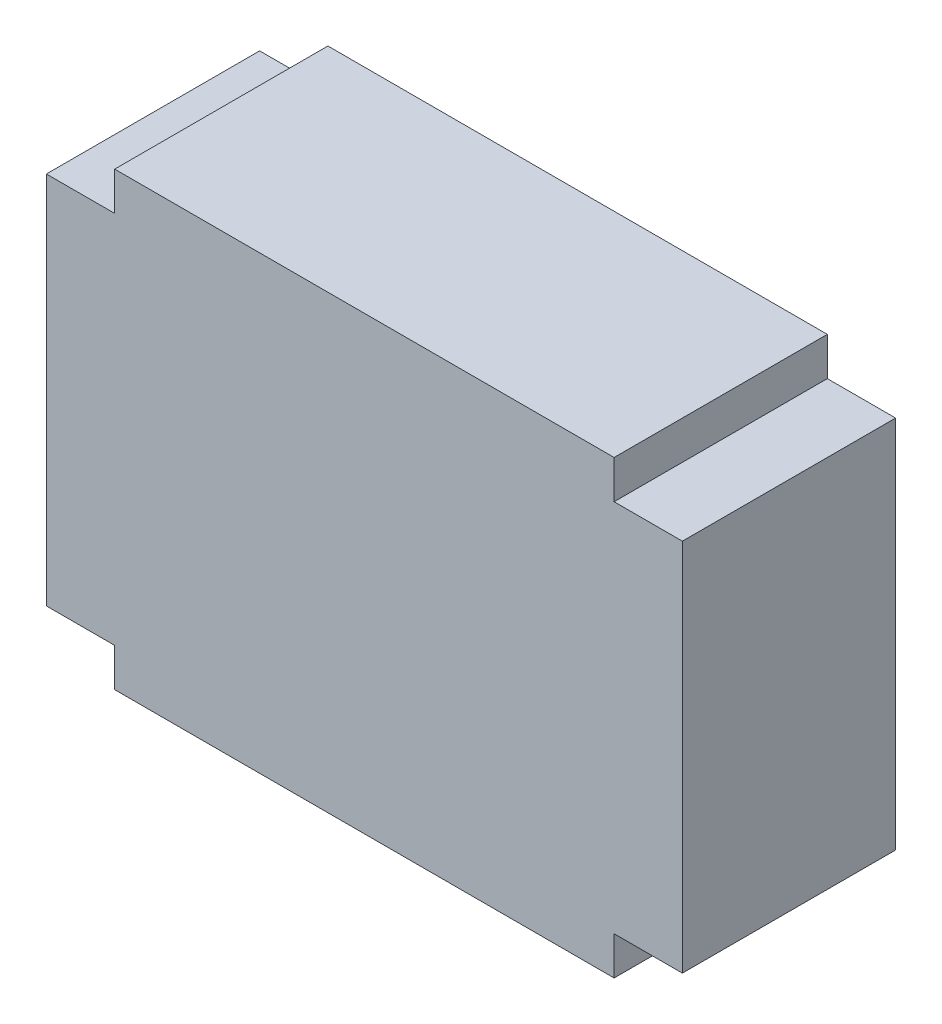
ISO-10303-21;
HEADER;
FILE_DESCRIPTION(('STEP AP214'),'2;1');
FILE_NAME('part.step','',(''),(''),'','','');
FILE_SCHEMA(('AUTOMOTIVE_DESIGN { 1 0 10303 214 1 1 1 1 }'));
ENDSEC;
DATA;
#1=APPLICATION_CONTEXT('core data for automotive mechanical design processes');
#2=APPLICATION_PROTOCOL_DEFINITION('international standard','automotive_design',2000,#1);
#3=PRODUCT_CONTEXT('',#1,'mechanical');
#4=PRODUCT('Part','Part','',(#3));
#5=PRODUCT_RELATED_PRODUCT_CATEGORY('part','',(#4));
#6=PRODUCT_DEFINITION_FORMATION('','',#4);
#7=PRODUCT_DEFINITION_CONTEXT('part definition',#1,'design');
#8=PRODUCT_DEFINITION('design','',#6,#7);
#9=PRODUCT_DEFINITION_SHAPE('','',#8);
#10=(LENGTH_UNIT() NAMED_UNIT(*) SI_UNIT(.MILLI.,.METRE.));
#11=(NAMED_UNIT(*) PLANE_ANGLE_UNIT() SI_UNIT($,.RADIAN.));
#12=(NAMED_UNIT(*) SI_UNIT($,.STERADIAN.) SOLID_ANGLE_UNIT());
#13=UNCERTAINTY_MEASURE_WITH_UNIT(LENGTH_MEASURE(1.E-05),#10,'distance_accuracy_value','');
#14=(GEOMETRIC_REPRESENTATION_CONTEXT(3) GLOBAL_UNCERTAINTY_ASSIGNED_CONTEXT((#13)) GLOBAL_UNIT_ASSIGNED_CONTEXT((#10,
#11,#12)) REPRESENTATION_CONTEXT('',''));
#15=CARTESIAN_POINT('',(0.,0.,0.));
#16=DIRECTION('',(0.,0.,1.));
#17=DIRECTION('',(1.,0.,0.));
#18=AXIS2_PLACEMENT_3D('',#15,#16,#17);
#19=CARTESIAN_POINT('',(-1.7,-1.,1.14));
#20=DIRECTION('',(1.,0.,0.));
#21=DIRECTION('',(0.,0.,-1.));
#22=AXIS2_PLACEMENT_3D('',#19,#20,#21);
#23=PLANE('',#22);
#24=DIRECTION('',(0.,-1.,0.));
#25=VECTOR('',#24,1.);
#26=CARTESIAN_POINT('',(-1.7,-1.,0.));
#27=LINE('',#26,#25);
#28=CARTESIAN_POINT('',(-1.7,1.,0.));
#29=VERTEX_POINT('',#28);
#30=CARTESIAN_POINT('',(-1.7,-1.,0.));
#31=VERTEX_POINT('',#30);
#32=EDGE_CURVE('E154',#29,#31,#27,.T.);
#33=ORIENTED_EDGE('',*,*,#32,.T.);
#34=DIRECTION('',(0.,0.,-1.));
#35=VECTOR('',#34,1.);
#36=CARTESIAN_POINT('',(-1.7,-1.,1.14));
#37=LINE('',#36,#35);
#38=CARTESIAN_POINT('',(-1.7,-1.,1.14));
#39=VERTEX_POINT('',#38);
#40=EDGE_CURVE('E11',#39,#31,#37,.T.);
#41=ORIENTED_EDGE('',*,*,#40,.F.);
#42=DIRECTION('',(0.,-1.,0.));
#43=VECTOR('',#42,1.);
#44=CARTESIAN_POINT('',(-1.7,-1.,1.14));
#45=LINE('',#44,#43);
#46=CARTESIAN_POINT('',(-1.7,1.,1.14));
#47=VERTEX_POINT('',#46);
#48=EDGE_CURVE('E176',#47,#39,#45,.T.);
#49=ORIENTED_EDGE('',*,*,#48,.F.);
#50=DIRECTION('',(0.,0.,-1.));
#51=VECTOR('',#50,1.);
#52=CARTESIAN_POINT('',(-1.7,1.,1.14));
#53=LINE('',#52,#51);
#54=EDGE_CURVE('E150',#47,#29,#53,.T.);
#55=ORIENTED_EDGE('',*,*,#54,.T.);
#56=EDGE_LOOP('',(#33,#41,#49,#55));
#57=FACE_BOUND('',#56,.T.);
#58=ADVANCED_FACE('F34',(#57),#23,.F.);
#59=CARTESIAN_POINT('',(-1.335,-1.,1.14));
#60=DIRECTION('',(0.,1.,0.));
#61=DIRECTION('',(0.,0.,1.));
#62=AXIS2_PLACEMENT_3D('',#59,#60,#61);
#63=PLANE('',#62);
#64=DIRECTION('',(1.,0.,0.));
#65=VECTOR('',#64,1.);
#66=CARTESIAN_POINT('',(-1.335,-1.,0.));
#67=LINE('',#66,#65);
#68=CARTESIAN_POINT('',(-1.335,-1.,0.));
#69=VERTEX_POINT('',#68);
#70=EDGE_CURVE('E157',#31,#69,#67,.T.);
#71=ORIENTED_EDGE('',*,*,#70,.T.);
#72=DIRECTION('',(0.,0.,-1.));
#73=VECTOR('',#72,1.);
#74=CARTESIAN_POINT('',(-1.335,-1.,1.14));
#75=LINE('',#74,#73);
#76=CARTESIAN_POINT('',(-1.335,-1.,1.14));
#77=VERTEX_POINT('',#76);
#78=EDGE_CURVE('E42',#77,#69,#75,.T.);
#79=ORIENTED_EDGE('',*,*,#78,.F.);
#80=DIRECTION('',(1.,0.,0.));
#81=VECTOR('',#80,1.);
#82=CARTESIAN_POINT('',(-1.335,-1.,1.14));
#83=LINE('',#82,#81);
#84=EDGE_CURVE('E105',#39,#77,#83,.T.);
#85=ORIENTED_EDGE('',*,*,#84,.F.);
#86=ORIENTED_EDGE('',*,*,#40,.T.);
#87=EDGE_LOOP('',(#71,#79,#85,#86));
#88=FACE_BOUND('',#87,.T.);
#89=ADVANCED_FACE('F254',(#88),#63,.F.);
#90=CARTESIAN_POINT('',(-1.335,-1.205,1.14));
#91=DIRECTION('',(1.,0.,0.));
#92=DIRECTION('',(0.,0.,-1.));
#93=AXIS2_PLACEMENT_3D('',#90,#91,#92);
#94=PLANE('',#93);
#95=DIRECTION('',(0.,-1.,0.));
#96=VECTOR('',#95,1.);
#97=CARTESIAN_POINT('',(-1.335,-1.205,0.));
#98=LINE('',#97,#96);
#99=CARTESIAN_POINT('',(-1.335,-1.205,0.));
#100=VERTEX_POINT('',#99);
#101=EDGE_CURVE('E159',#69,#100,#98,.T.);
#102=ORIENTED_EDGE('',*,*,#101,.T.);
#103=DIRECTION('',(0.,0.,-1.));
#104=VECTOR('',#103,1.);
#105=CARTESIAN_POINT('',(-1.335,-1.205,1.14));
#106=LINE('',#105,#104);
#107=CARTESIAN_POINT('',(-1.335,-1.205,1.14));
#108=VERTEX_POINT('',#107);
#109=EDGE_CURVE('E195',#108,#100,#106,.T.);
#110=ORIENTED_EDGE('',*,*,#109,.F.);
#111=DIRECTION('',(0.,-1.,0.));
#112=VECTOR('',#111,1.);
#113=CARTESIAN_POINT('',(-1.335,-1.205,1.14));
#114=LINE('',#113,#112);
#115=EDGE_CURVE('E203',#77,#108,#114,.T.);
#116=ORIENTED_EDGE('',*,*,#115,.F.);
#117=ORIENTED_EDGE('',*,*,#78,.T.);
#118=EDGE_LOOP('',(#102,#110,#116,#117));
#119=FACE_BOUND('',#118,.T.);
#120=ADVANCED_FACE('F201',(#119),#94,.F.);
#121=CARTESIAN_POINT('',(1.335,-1.205,1.14));
#122=DIRECTION('',(0.,1.,0.));
#123=DIRECTION('',(0.,0.,1.));
#124=AXIS2_PLACEMENT_3D('',#121,#122,#123);
#125=PLANE('',#124);
#126=DIRECTION('',(1.,0.,0.));
#127=VECTOR('',#126,1.);
#128=CARTESIAN_POINT('',(1.335,-1.205,0.));
#129=LINE('',#128,#127);
#130=CARTESIAN_POINT('',(1.335,-1.205,0.));
#131=VERTEX_POINT('',#130);
#132=EDGE_CURVE('E161',#100,#131,#129,.T.);
#133=ORIENTED_EDGE('',*,*,#132,.T.);
#134=DIRECTION('',(0.,0.,-1.));
#135=VECTOR('',#134,1.);
#136=CARTESIAN_POINT('',(1.335,-1.205,1.14));
#137=LINE('',#136,#135);
#138=CARTESIAN_POINT('',(1.335,-1.205,1.14));
#139=VERTEX_POINT('',#138);
#140=EDGE_CURVE('E192',#139,#131,#137,.T.);
#141=ORIENTED_EDGE('',*,*,#140,.F.);
#142=DIRECTION('',(1.,0.,0.));
#143=VECTOR('',#142,1.);
#144=CARTESIAN_POINT('',(1.335,-1.205,1.14));
#145=LINE('',#144,#143);
#146=EDGE_CURVE('E221',#108,#139,#145,.T.);
#147=ORIENTED_EDGE('',*,*,#146,.F.);
#148=ORIENTED_EDGE('',*,*,#109,.T.);
#149=EDGE_LOOP('',(#133,#141,#147,#148));
#150=FACE_BOUND('',#149,.T.);
#151=ADVANCED_FACE('F212',(#150),#125,.F.);
#152=CARTESIAN_POINT('',(1.335,-1.,1.14));
#153=DIRECTION('',(-1.,0.,0.));
#154=DIRECTION('',(0.,0.,1.));
#155=AXIS2_PLACEMENT_3D('',#152,#153,#154);
#156=PLANE('',#155);
#157=DIRECTION('',(0.,1.,0.));
#158=VECTOR('',#157,1.);
#159=CARTESIAN_POINT('',(1.335,-1.,0.));
#160=LINE('',#159,#158);
#161=CARTESIAN_POINT('',(1.335,-1.,0.));
#162=VERTEX_POINT('',#161);
#163=EDGE_CURVE('E163',#131,#162,#160,.T.);
#164=ORIENTED_EDGE('',*,*,#163,.T.);
#165=DIRECTION('',(0.,0.,-1.));
#166=VECTOR('',#165,1.);
#167=CARTESIAN_POINT('',(1.335,-1.,1.14));
#168=LINE('',#167,#166);
#169=CARTESIAN_POINT('',(1.335,-1.,1.14));
#170=VERTEX_POINT('',#169);
#171=EDGE_CURVE('E189',#170,#162,#168,.T.);
#172=ORIENTED_EDGE('',*,*,#171,.F.);
#173=DIRECTION('',(0.,1.,0.));
#174=VECTOR('',#173,1.);
#175=CARTESIAN_POINT('',(1.335,-1.,1.14));
#176=LINE('',#175,#174);
#177=EDGE_CURVE('E218',#139,#170,#176,.T.);
#178=ORIENTED_EDGE('',*,*,#177,.F.);
#179=ORIENTED_EDGE('',*,*,#140,.T.);
#180=EDGE_LOOP('',(#164,#172,#178,#179));
#181=FACE_BOUND('',#180,.T.);
#182=ADVANCED_FACE('F216',(#181),#156,.F.);
#183=CARTESIAN_POINT('',(1.7,-1.,1.14));
#184=DIRECTION('',(0.,1.,0.));
#185=DIRECTION('',(0.,0.,1.));
#186=AXIS2_PLACEMENT_3D('',#183,#184,#185);
#187=PLANE('',#186);
#188=DIRECTION('',(1.,0.,0.));
#189=VECTOR('',#188,1.);
#190=CARTESIAN_POINT('',(1.7,-1.,0.));
#191=LINE('',#190,#189);
#192=CARTESIAN_POINT('',(1.7,-1.,0.));
#193=VERTEX_POINT('',#192);
#194=EDGE_CURVE('E165',#162,#193,#191,.T.);
#195=ORIENTED_EDGE('',*,*,#194,.T.);
#196=DIRECTION('',(0.,0.,-1.));
#197=VECTOR('',#196,1.);
#198=CARTESIAN_POINT('',(1.7,-1.,1.14));
#199=LINE('',#198,#197);
#200=CARTESIAN_POINT('',(1.7,-1.,1.14));
#201=VERTEX_POINT('',#200);
#202=EDGE_CURVE('E186',#201,#193,#199,.T.);
#203=ORIENTED_EDGE('',*,*,#202,.F.);
#204=DIRECTION('',(1.,0.,0.));
#205=VECTOR('',#204,1.);
#206=CARTESIAN_POINT('',(1.7,-1.,1.14));
#207=LINE('',#206,#205);
#208=EDGE_CURVE('E220',#170,#201,#207,.T.);
#209=ORIENTED_EDGE('',*,*,#208,.F.);
#210=ORIENTED_EDGE('',*,*,#171,.T.);
#211=EDGE_LOOP('',(#195,#203,#209,#210));
#212=FACE_BOUND('',#211,.T.);
#213=ADVANCED_FACE('F267',(#212),#187,.F.);
#214=CARTESIAN_POINT('',(1.7,1.,1.14));
#215=DIRECTION('',(-1.,0.,0.));
#216=DIRECTION('',(0.,0.,1.));
#217=AXIS2_PLACEMENT_3D('',#214,#215,#216);
#218=PLANE('',#217);
#219=DIRECTION('',(0.,1.,0.));
#220=VECTOR('',#219,1.);
#221=CARTESIAN_POINT('',(1.7,1.,0.));
#222=LINE('',#221,#220);
#223=CARTESIAN_POINT('',(1.7,1.,0.));
#224=VERTEX_POINT('',#223);
#225=EDGE_CURVE('E167',#193,#224,#222,.T.);
#226=ORIENTED_EDGE('',*,*,#225,.T.);
#227=DIRECTION('',(0.,0.,-1.));
#228=VECTOR('',#227,1.);
#229=CARTESIAN_POINT('',(1.7,1.,1.14));
#230=LINE('',#229,#228);
#231=CARTESIAN_POINT('',(1.7,1.,1.14));
#232=VERTEX_POINT('',#231);
#233=EDGE_CURVE('E183',#232,#224,#230,.T.);
#234=ORIENTED_EDGE('',*,*,#233,.F.);
#235=DIRECTION('',(0.,1.,0.));
#236=VECTOR('',#235,1.);
#237=CARTESIAN_POINT('',(1.7,1.,1.14));
#238=LINE('',#237,#236);
#239=EDGE_CURVE('E223',#201,#232,#238,.T.);
#240=ORIENTED_EDGE('',*,*,#239,.F.);
#241=ORIENTED_EDGE('',*,*,#202,.T.);
#242=EDGE_LOOP('',(#226,#234,#240,#241));
#243=FACE_BOUND('',#242,.T.);
#244=ADVANCED_FACE('F270',(#243),#218,.F.);
#245=CARTESIAN_POINT('',(1.335,1.,1.14));
#246=DIRECTION('',(0.,-1.,0.));
#247=DIRECTION('',(0.,0.,-1.));
#248=AXIS2_PLACEMENT_3D('',#245,#246,#247);
#249=PLANE('',#248);
#250=DIRECTION('',(-1.,0.,0.));
#251=VECTOR('',#250,1.);
#252=CARTESIAN_POINT('',(1.335,1.,0.));
#253=LINE('',#252,#251);
#254=CARTESIAN_POINT('',(1.335,1.,0.));
#255=VERTEX_POINT('',#254);
#256=EDGE_CURVE('E169',#224,#255,#253,.T.);
#257=ORIENTED_EDGE('',*,*,#256,.T.);
#258=DIRECTION('',(0.,0.,-1.));
#259=VECTOR('',#258,1.);
#260=CARTESIAN_POINT('',(1.335,1.,1.14));
#261=LINE('',#260,#259);
#262=CARTESIAN_POINT('',(1.335,1.,1.14));
#263=VERTEX_POINT('',#262);
#264=EDGE_CURVE('E180',#263,#255,#261,.T.);
#265=ORIENTED_EDGE('',*,*,#264,.F.);
#266=DIRECTION('',(-1.,0.,0.));
#267=VECTOR('',#266,1.);
#268=CARTESIAN_POINT('',(1.335,1.,1.14));
#269=LINE('',#268,#267);
#270=EDGE_CURVE('E229',#232,#263,#269,.T.);
#271=ORIENTED_EDGE('',*,*,#270,.F.);
#272=ORIENTED_EDGE('',*,*,#233,.T.);
#273=EDGE_LOOP('',(#257,#265,#271,#272));
#274=FACE_BOUND('',#273,.T.);
#275=ADVANCED_FACE('F235',(#274),#249,.F.);
#276=CARTESIAN_POINT('',(1.335,1.205,1.14));
#277=DIRECTION('',(-1.,0.,0.));
#278=DIRECTION('',(0.,0.,1.));
#279=AXIS2_PLACEMENT_3D('',#276,#277,#278);
#280=PLANE('',#279);
#281=DIRECTION('',(0.,1.,0.));
#282=VECTOR('',#281,1.);
#283=CARTESIAN_POINT('',(1.335,1.205,0.));
#284=LINE('',#283,#282);
#285=CARTESIAN_POINT('',(1.335,1.205,0.));
#286=VERTEX_POINT('',#285);
#287=EDGE_CURVE('E171',#255,#286,#284,.T.);
#288=ORIENTED_EDGE('',*,*,#287,.T.);
#289=DIRECTION('',(0.,0.,-1.));
#290=VECTOR('',#289,1.);
#291=CARTESIAN_POINT('',(1.335,1.205,1.14));
#292=LINE('',#291,#290);
#293=CARTESIAN_POINT('',(1.335,1.205,1.14));
#294=VERTEX_POINT('',#293);
#295=EDGE_CURVE('E145',#294,#286,#292,.T.);
#296=ORIENTED_EDGE('',*,*,#295,.F.);
#297=DIRECTION('',(0.,1.,0.));
#298=VECTOR('',#297,1.);
#299=CARTESIAN_POINT('',(1.335,1.205,1.14));
#300=LINE('',#299,#298);
#301=EDGE_CURVE('E136',#263,#294,#300,.T.);
#302=ORIENTED_EDGE('',*,*,#301,.F.);
#303=ORIENTED_EDGE('',*,*,#264,.T.);
#304=EDGE_LOOP('',(#288,#296,#302,#303));
#305=FACE_BOUND('',#304,.T.);
#306=ADVANCED_FACE('F239',(#305),#280,.F.);
#307=CARTESIAN_POINT('',(-1.335,1.205,1.14));
#308=DIRECTION('',(0.,-1.,0.));
#309=DIRECTION('',(0.,0.,-1.));
#310=AXIS2_PLACEMENT_3D('',#307,#308,#309);
#311=PLANE('',#310);
#312=DIRECTION('',(-1.,0.,0.));
#313=VECTOR('',#312,1.);
#314=CARTESIAN_POINT('',(-1.335,1.205,0.));
#315=LINE('',#314,#313);
#316=CARTESIAN_POINT('',(-1.335,1.205,0.));
#317=VERTEX_POINT('',#316);
#318=EDGE_CURVE('E144',#286,#317,#315,.T.);
#319=ORIENTED_EDGE('',*,*,#318,.T.);
#320=DIRECTION('',(0.,0.,-1.));
#321=VECTOR('',#320,1.);
#322=CARTESIAN_POINT('',(-1.335,1.205,1.14));
#323=LINE('',#322,#321);
#324=CARTESIAN_POINT('',(-1.335,1.205,1.14));
#325=VERTEX_POINT('',#324);
#326=EDGE_CURVE('E141',#325,#317,#323,.T.);
#327=ORIENTED_EDGE('',*,*,#326,.F.);
#328=DIRECTION('',(-1.,0.,0.));
#329=VECTOR('',#328,1.);
#330=CARTESIAN_POINT('',(-1.335,1.205,1.14));
#331=LINE('',#330,#329);
#332=EDGE_CURVE('E130',#294,#325,#331,.T.);
#333=ORIENTED_EDGE('',*,*,#332,.F.);
#334=ORIENTED_EDGE('',*,*,#295,.T.);
#335=EDGE_LOOP('',(#319,#327,#333,#334));
#336=FACE_BOUND('',#335,.T.);
#337=ADVANCED_FACE('F142',(#336),#311,.F.);
#338=CARTESIAN_POINT('',(-1.335,1.,1.14));
#339=DIRECTION('',(1.,0.,0.));
#340=DIRECTION('',(0.,0.,-1.));
#341=AXIS2_PLACEMENT_3D('',#338,#339,#340);
#342=PLANE('',#341);
#343=DIRECTION('',(0.,-1.,0.));
#344=VECTOR('',#343,1.);
#345=CARTESIAN_POINT('',(-1.335,1.,0.));
#346=LINE('',#345,#344);
#347=CARTESIAN_POINT('',(-1.335,1.,0.));
#348=VERTEX_POINT('',#347);
#349=EDGE_CURVE('E91',#317,#348,#346,.T.);
#350=ORIENTED_EDGE('',*,*,#349,.T.);
#351=DIRECTION('',(0.,0.,-1.));
#352=VECTOR('',#351,1.);
#353=CARTESIAN_POINT('',(-1.335,1.,1.14));
#354=LINE('',#353,#352);
#355=CARTESIAN_POINT('',(-1.335,1.,1.14));
#356=VERTEX_POINT('',#355);
#357=EDGE_CURVE('E146',#356,#348,#354,.T.);
#358=ORIENTED_EDGE('',*,*,#357,.F.);
#359=DIRECTION('',(0.,-1.,0.));
#360=VECTOR('',#359,1.);
#361=CARTESIAN_POINT('',(-1.335,1.,1.14));
#362=LINE('',#361,#360);
#363=EDGE_CURVE('E134',#325,#356,#362,.T.);
#364=ORIENTED_EDGE('',*,*,#363,.F.);
#365=ORIENTED_EDGE('',*,*,#326,.T.);
#366=EDGE_LOOP('',(#350,#358,#364,#365));
#367=FACE_BOUND('',#366,.T.);
#368=ADVANCED_FACE('F148',(#367),#342,.F.);
#369=CARTESIAN_POINT('',(-1.7,1.,1.14));
#370=DIRECTION('',(0.,-1.,0.));
#371=DIRECTION('',(0.,0.,-1.));
#372=AXIS2_PLACEMENT_3D('',#369,#370,#371);
#373=PLANE('',#372);
#374=DIRECTION('',(-1.,0.,0.));
#375=VECTOR('',#374,1.);
#376=CARTESIAN_POINT('',(-1.7,1.,0.));
#377=LINE('',#376,#375);
#378=EDGE_CURVE('E97',#348,#29,#377,.T.);
#379=ORIENTED_EDGE('',*,*,#378,.T.);
#380=ORIENTED_EDGE('',*,*,#54,.F.);
#381=DIRECTION('',(-1.,0.,0.));
#382=VECTOR('',#381,1.);
#383=CARTESIAN_POINT('',(-1.7,1.,1.14));
#384=LINE('',#383,#382);
#385=EDGE_CURVE('E50',#356,#47,#384,.T.);
#386=ORIENTED_EDGE('',*,*,#385,.F.);
#387=ORIENTED_EDGE('',*,*,#357,.T.);
#388=EDGE_LOOP('',(#379,#380,#386,#387));
#389=FACE_BOUND('',#388,.T.);
#390=ADVANCED_FACE('F243',(#389),#373,.F.);
#391=CARTESIAN_POINT('',(0.,0.,1.14));
#392=DIRECTION('',(0.,0.,-1.));
#393=DIRECTION('',(-1.,0.,0.));
#394=AXIS2_PLACEMENT_3D('',#391,#392,#393);
#395=PLANE('',#394);
#396=ORIENTED_EDGE('',*,*,#48,.T.);
#397=ORIENTED_EDGE('',*,*,#84,.T.);
#398=ORIENTED_EDGE('',*,*,#115,.T.);
#399=ORIENTED_EDGE('',*,*,#146,.T.);
#400=ORIENTED_EDGE('',*,*,#177,.T.);
#401=ORIENTED_EDGE('',*,*,#208,.T.);
#402=ORIENTED_EDGE('',*,*,#239,.T.);
#403=ORIENTED_EDGE('',*,*,#270,.T.);
#404=ORIENTED_EDGE('',*,*,#301,.T.);
#405=ORIENTED_EDGE('',*,*,#332,.T.);
#406=ORIENTED_EDGE('',*,*,#363,.T.);
#407=ORIENTED_EDGE('',*,*,#385,.T.);
#408=EDGE_LOOP('',(#396,#397,#398,#399,#400,#401,#402,#403,#404,#405,#406,#407));
#409=FACE_BOUND('',#408,.T.);
#410=ADVANCED_FACE('F132',(#409),#395,.F.);
#411=CARTESIAN_POINT('',(0.,0.,0.));
#412=DIRECTION('',(0.,0.,-1.));
#413=DIRECTION('',(-1.,0.,0.));
#414=AXIS2_PLACEMENT_3D('',#411,#412,#413);
#415=PLANE('',#414);
#416=ORIENTED_EDGE('',*,*,#32,.F.);
#417=ORIENTED_EDGE('',*,*,#378,.F.);
#418=ORIENTED_EDGE('',*,*,#349,.F.);
#419=ORIENTED_EDGE('',*,*,#318,.F.);
#420=ORIENTED_EDGE('',*,*,#287,.F.);
#421=ORIENTED_EDGE('',*,*,#256,.F.);
#422=ORIENTED_EDGE('',*,*,#225,.F.);
#423=ORIENTED_EDGE('',*,*,#194,.F.);
#424=ORIENTED_EDGE('',*,*,#163,.F.);
#425=ORIENTED_EDGE('',*,*,#132,.F.);
#426=ORIENTED_EDGE('',*,*,#101,.F.);
#427=ORIENTED_EDGE('',*,*,#70,.F.);
#428=EDGE_LOOP('',(#416,#417,#418,#419,#420,#421,#422,#423,#424,#425,#426,#427));
#429=FACE_BOUND('',#428,.T.);
#430=ADVANCED_FACE('F207',(#429),#415,.T.);
#431=CLOSED_SHELL('',(#58,#89,#120,#151,#182,#213,#244,#275,#306,#337,#368,#390,#410,#430));
#432=MANIFOLD_SOLID_BREP('B2',#431);
#433=ADVANCED_BREP_SHAPE_REPRESENTATION('',(#18,#432),#14);
#434=SHAPE_DEFINITION_REPRESENTATION(#9,#433);
ENDSEC;
END-ISO-10303-21;
